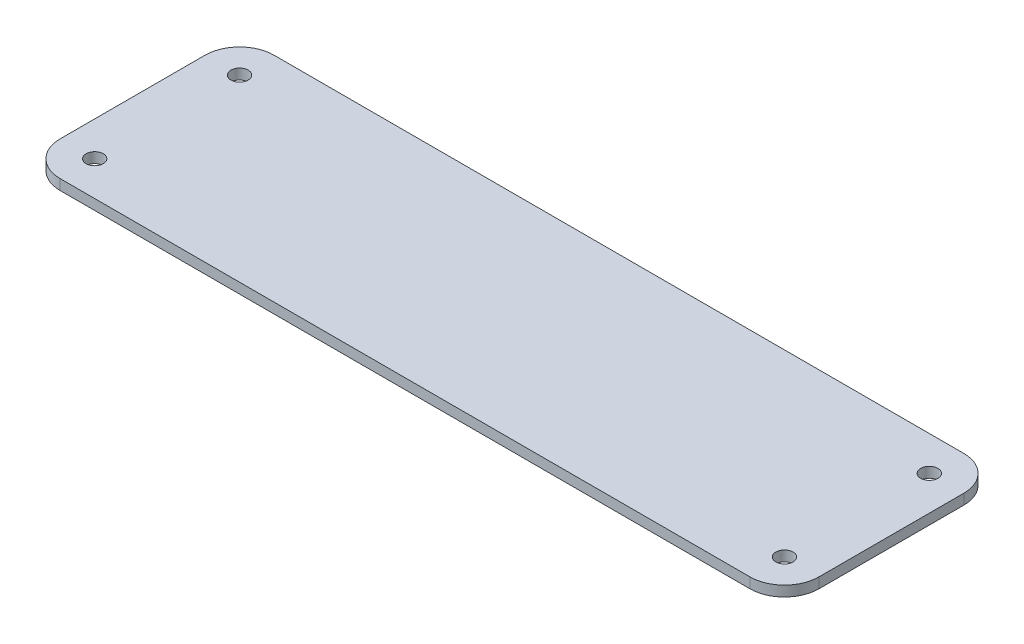
ISO-10303-21;
HEADER;
FILE_DESCRIPTION(('STEP AP214'),'2;1');
FILE_NAME('part.step','',(''),(''),'','','');
FILE_SCHEMA(('AUTOMOTIVE_DESIGN { 1 0 10303 214 1 1 1 1 }'));
ENDSEC;
DATA;
#1=APPLICATION_CONTEXT('core data for automotive mechanical design processes');
#2=APPLICATION_PROTOCOL_DEFINITION('international standard','automotive_design',2000,#1);
#3=PRODUCT_CONTEXT('',#1,'mechanical');
#4=PRODUCT('Part','Part','',(#3));
#5=PRODUCT_RELATED_PRODUCT_CATEGORY('part','',(#4));
#6=PRODUCT_DEFINITION_FORMATION('','',#4);
#7=PRODUCT_DEFINITION_CONTEXT('part definition',#1,'design');
#8=PRODUCT_DEFINITION('design','',#6,#7);
#9=PRODUCT_DEFINITION_SHAPE('','',#8);
#10=(LENGTH_UNIT() NAMED_UNIT(*) SI_UNIT(.MILLI.,.METRE.));
#11=(NAMED_UNIT(*) PLANE_ANGLE_UNIT() SI_UNIT($,.RADIAN.));
#12=(NAMED_UNIT(*) SI_UNIT($,.STERADIAN.) SOLID_ANGLE_UNIT());
#13=UNCERTAINTY_MEASURE_WITH_UNIT(LENGTH_MEASURE(1.E-05),#10,'distance_accuracy_value','');
#14=(GEOMETRIC_REPRESENTATION_CONTEXT(3) GLOBAL_UNCERTAINTY_ASSIGNED_CONTEXT((#13)) GLOBAL_UNIT_ASSIGNED_CONTEXT((#10,
#11,#12)) REPRESENTATION_CONTEXT('',''));
#15=CARTESIAN_POINT('',(0.,0.,0.));
#16=DIRECTION('',(0.,0.,1.));
#17=DIRECTION('',(1.,0.,0.));
#18=AXIS2_PLACEMENT_3D('',#15,#16,#17);
#19=CARTESIAN_POINT('',(-100.,3.,-10.));
#20=DIRECTION('',(0.,1.,0.));
#21=DIRECTION('',(0.,0.,1.));
#22=AXIS2_PLACEMENT_3D('',#19,#20,#21);
#23=PLANE('',#22);
#24=CARTESIAN_POINT('',(100.,3.,-52.));
#25=DIRECTION('',(0.,1.,0.));
#26=DIRECTION('',(0.,0.,-1.));
#27=AXIS2_PLACEMENT_3D('',#24,#25,#26);
#28=CIRCLE('',#27,2.50000000000001);
#29=CARTESIAN_POINT('',(100.,3.,-54.5));
#30=VERTEX_POINT('',#29);
#31=EDGE_CURVE('E188',#30,#30,#28,.T.);
#32=ORIENTED_EDGE('',*,*,#31,.F.);
#33=EDGE_LOOP('',(#32));
#34=FACE_BOUND('',#33,.T.);
#35=CARTESIAN_POINT('',(-100.,3.,-52.));
#36=DIRECTION('',(0.,1.,0.));
#37=DIRECTION('',(0.,0.,1.));
#38=AXIS2_PLACEMENT_3D('',#35,#36,#37);
#39=CIRCLE('',#38,2.50000000000001);
#40=CARTESIAN_POINT('',(-100.,3.,-49.5));
#41=VERTEX_POINT('',#40);
#42=EDGE_CURVE('E134',#41,#41,#39,.T.);
#43=ORIENTED_EDGE('',*,*,#42,.F.);
#44=EDGE_LOOP('',(#43));
#45=FACE_BOUND('',#44,.T.);
#46=CARTESIAN_POINT('',(-100.,3.,-10.));
#47=DIRECTION('',(0.,1.,0.));
#48=DIRECTION('',(0.,0.,1.));
#49=AXIS2_PLACEMENT_3D('',#46,#47,#48);
#50=CIRCLE('',#49,10.);
#51=CARTESIAN_POINT('',(-110.,3.,-10.0000000000001));
#52=VERTEX_POINT('',#51);
#53=CARTESIAN_POINT('',(-99.9999999999999,3.,0.));
#54=VERTEX_POINT('',#53);
#55=EDGE_CURVE('E145',#52,#54,#50,.T.);
#56=ORIENTED_EDGE('',*,*,#55,.T.);
#57=DIRECTION('',(1.,0.,0.));
#58=VECTOR('',#57,1.);
#59=CARTESIAN_POINT('',(-99.9999999999999,3.,0.));
#60=LINE('',#59,#58);
#61=CARTESIAN_POINT('',(99.9999999999999,3.,0.));
#62=VERTEX_POINT('',#61);
#63=EDGE_CURVE('E93',#54,#62,#60,.T.);
#64=ORIENTED_EDGE('',*,*,#63,.T.);
#65=CARTESIAN_POINT('',(100.,3.,-10.));
#66=DIRECTION('',(0.,1.,0.));
#67=DIRECTION('',(0.,0.,1.));
#68=AXIS2_PLACEMENT_3D('',#65,#66,#67);
#69=CIRCLE('',#68,10.);
#70=CARTESIAN_POINT('',(110.,3.,-10.0000000000001));
#71=VERTEX_POINT('',#70);
#72=EDGE_CURVE('E160',#62,#71,#69,.T.);
#73=ORIENTED_EDGE('',*,*,#72,.T.);
#74=DIRECTION('',(0.,0.,-1.));
#75=VECTOR('',#74,1.);
#76=CARTESIAN_POINT('',(110.,3.,-51.9999999999999));
#77=LINE('',#76,#75);
#78=CARTESIAN_POINT('',(110.,3.,-51.9999999999999));
#79=VERTEX_POINT('',#78);
#80=EDGE_CURVE('E173',#71,#79,#77,.T.);
#81=ORIENTED_EDGE('',*,*,#80,.T.);
#82=CARTESIAN_POINT('',(100.,3.,-52.));
#83=DIRECTION('',(0.,1.,0.));
#84=DIRECTION('',(0.,0.,-1.));
#85=AXIS2_PLACEMENT_3D('',#82,#83,#84);
#86=CIRCLE('',#85,10.);
#87=CARTESIAN_POINT('',(99.9999999999999,3.,-62.));
#88=VERTEX_POINT('',#87);
#89=EDGE_CURVE('E112',#79,#88,#86,.T.);
#90=ORIENTED_EDGE('',*,*,#89,.T.);
#91=DIRECTION('',(-1.,0.,0.));
#92=VECTOR('',#91,1.);
#93=CARTESIAN_POINT('',(-99.9999999999999,3.,-62.));
#94=LINE('',#93,#92);
#95=CARTESIAN_POINT('',(-99.9999999999999,3.,-62.));
#96=VERTEX_POINT('',#95);
#97=EDGE_CURVE('E106',#88,#96,#94,.T.);
#98=ORIENTED_EDGE('',*,*,#97,.T.);
#99=CARTESIAN_POINT('',(-100.,3.,-52.));
#100=DIRECTION('',(0.,1.,0.));
#101=DIRECTION('',(0.,0.,1.));
#102=AXIS2_PLACEMENT_3D('',#99,#100,#101);
#103=CIRCLE('',#102,9.99999999999999);
#104=CARTESIAN_POINT('',(-110.,3.,-51.9999999999999));
#105=VERTEX_POINT('',#104);
#106=EDGE_CURVE('E110',#96,#105,#103,.T.);
#107=ORIENTED_EDGE('',*,*,#106,.T.);
#108=DIRECTION('',(0.,0.,1.));
#109=VECTOR('',#108,1.);
#110=CARTESIAN_POINT('',(-110.,3.,-51.9999999999999));
#111=LINE('',#110,#109);
#112=EDGE_CURVE('E50',#105,#52,#111,.T.);
#113=ORIENTED_EDGE('',*,*,#112,.T.);
#114=EDGE_LOOP('',(#56,#64,#73,#81,#90,#98,#107,#113));
#115=FACE_BOUND('',#114,.T.);
#116=CARTESIAN_POINT('',(-100.,3.,-10.));
#117=DIRECTION('',(0.,1.,0.));
#118=DIRECTION('',(0.,0.,1.));
#119=AXIS2_PLACEMENT_3D('',#116,#117,#118);
#120=CIRCLE('',#119,2.49999999999999);
#121=CARTESIAN_POINT('',(-100.,3.,-7.50000000000001));
#122=VERTEX_POINT('',#121);
#123=EDGE_CURVE('E182',#122,#122,#120,.T.);
#124=ORIENTED_EDGE('',*,*,#123,.F.);
#125=EDGE_LOOP('',(#124));
#126=FACE_BOUND('',#125,.T.);
#127=CARTESIAN_POINT('',(100.,3.,-10.));
#128=DIRECTION('',(0.,1.,0.));
#129=DIRECTION('',(0.,0.,-1.));
#130=AXIS2_PLACEMENT_3D('',#127,#128,#129);
#131=CIRCLE('',#130,2.49999999999999);
#132=CARTESIAN_POINT('',(100.,3.,-12.5));
#133=VERTEX_POINT('',#132);
#134=EDGE_CURVE('E194',#133,#133,#131,.T.);
#135=ORIENTED_EDGE('',*,*,#134,.F.);
#136=EDGE_LOOP('',(#135));
#137=FACE_BOUND('',#136,.T.);
#138=ADVANCED_FACE('F33',(#34,#45,#115,#126,#137),#23,.T.);
#139=CARTESIAN_POINT('',(-100.,0.,-10.));
#140=DIRECTION('',(0.,1.,0.));
#141=DIRECTION('',(0.,0.,1.));
#142=AXIS2_PLACEMENT_3D('',#139,#140,#141);
#143=PLANE('',#142);
#144=CARTESIAN_POINT('',(-100.,0.,-10.));
#145=DIRECTION('',(0.,1.,0.));
#146=DIRECTION('',(0.,0.,1.));
#147=AXIS2_PLACEMENT_3D('',#144,#145,#146);
#148=CIRCLE('',#147,10.);
#149=CARTESIAN_POINT('',(-110.,0.,-10.0000000000001));
#150=VERTEX_POINT('',#149);
#151=CARTESIAN_POINT('',(-99.9999999999999,0.,0.));
#152=VERTEX_POINT('',#151);
#153=EDGE_CURVE('E130',#150,#152,#148,.T.);
#154=ORIENTED_EDGE('',*,*,#153,.F.);
#155=DIRECTION('',(0.,0.,1.));
#156=VECTOR('',#155,1.);
#157=CARTESIAN_POINT('',(-110.,0.,-51.9999999999999));
#158=LINE('',#157,#156);
#159=CARTESIAN_POINT('',(-110.,0.,-51.9999999999999));
#160=VERTEX_POINT('',#159);
#161=EDGE_CURVE('E85',#160,#150,#158,.T.);
#162=ORIENTED_EDGE('',*,*,#161,.F.);
#163=CARTESIAN_POINT('',(-100.,0.,-52.));
#164=DIRECTION('',(0.,1.,0.));
#165=DIRECTION('',(0.,0.,1.));
#166=AXIS2_PLACEMENT_3D('',#163,#164,#165);
#167=CIRCLE('',#166,9.99999999999999);
#168=CARTESIAN_POINT('',(-99.9999999999999,0.,-62.));
#169=VERTEX_POINT('',#168);
#170=EDGE_CURVE('E79',#169,#160,#167,.T.);
#171=ORIENTED_EDGE('',*,*,#170,.F.);
#172=DIRECTION('',(-1.,0.,0.));
#173=VECTOR('',#172,1.);
#174=CARTESIAN_POINT('',(-99.9999999999999,0.,-62.));
#175=LINE('',#174,#173);
#176=CARTESIAN_POINT('',(99.9999999999999,0.,-62.));
#177=VERTEX_POINT('',#176);
#178=EDGE_CURVE('E120',#177,#169,#175,.T.);
#179=ORIENTED_EDGE('',*,*,#178,.F.);
#180=CARTESIAN_POINT('',(100.,0.,-52.));
#181=DIRECTION('',(0.,1.,0.));
#182=DIRECTION('',(0.,0.,-1.));
#183=AXIS2_PLACEMENT_3D('',#180,#181,#182);
#184=CIRCLE('',#183,10.);
#185=CARTESIAN_POINT('',(110.,0.,-51.9999999999999));
#186=VERTEX_POINT('',#185);
#187=EDGE_CURVE('E140',#186,#177,#184,.T.);
#188=ORIENTED_EDGE('',*,*,#187,.F.);
#189=DIRECTION('',(0.,0.,-1.));
#190=VECTOR('',#189,1.);
#191=CARTESIAN_POINT('',(110.,0.,-51.9999999999999));
#192=LINE('',#191,#190);
#193=CARTESIAN_POINT('',(110.,0.,-10.0000000000001));
#194=VERTEX_POINT('',#193);
#195=EDGE_CURVE('E138',#194,#186,#192,.T.);
#196=ORIENTED_EDGE('',*,*,#195,.F.);
#197=CARTESIAN_POINT('',(100.,0.,-10.));
#198=DIRECTION('',(0.,1.,0.));
#199=DIRECTION('',(0.,0.,1.));
#200=AXIS2_PLACEMENT_3D('',#197,#198,#199);
#201=CIRCLE('',#200,10.);
#202=CARTESIAN_POINT('',(99.9999999999999,0.,0.));
#203=VERTEX_POINT('',#202);
#204=EDGE_CURVE('E136',#203,#194,#201,.T.);
#205=ORIENTED_EDGE('',*,*,#204,.F.);
#206=DIRECTION('',(1.,0.,0.));
#207=VECTOR('',#206,1.);
#208=CARTESIAN_POINT('',(-99.9999999999999,0.,0.));
#209=LINE('',#208,#207);
#210=EDGE_CURVE('E133',#152,#203,#209,.T.);
#211=ORIENTED_EDGE('',*,*,#210,.F.);
#212=EDGE_LOOP('',(#154,#162,#171,#179,#188,#196,#205,#211));
#213=FACE_BOUND('',#212,.T.);
#214=CARTESIAN_POINT('',(-100.,0.,-52.));
#215=DIRECTION('',(0.,1.,0.));
#216=DIRECTION('',(0.,0.,1.));
#217=AXIS2_PLACEMENT_3D('',#214,#215,#216);
#218=CIRCLE('',#217,2.50000000000001);
#219=CARTESIAN_POINT('',(-100.,0.,-49.5));
#220=VERTEX_POINT('',#219);
#221=EDGE_CURVE('E179',#220,#220,#218,.T.);
#222=ORIENTED_EDGE('',*,*,#221,.T.);
#223=EDGE_LOOP('',(#222));
#224=FACE_BOUND('',#223,.T.);
#225=CARTESIAN_POINT('',(-100.,0.,-10.));
#226=DIRECTION('',(0.,1.,0.));
#227=DIRECTION('',(0.,0.,1.));
#228=AXIS2_PLACEMENT_3D('',#225,#226,#227);
#229=CIRCLE('',#228,2.49999999999999);
#230=CARTESIAN_POINT('',(-100.,0.,-7.50000000000001));
#231=VERTEX_POINT('',#230);
#232=EDGE_CURVE('E185',#231,#231,#229,.T.);
#233=ORIENTED_EDGE('',*,*,#232,.T.);
#234=EDGE_LOOP('',(#233));
#235=FACE_BOUND('',#234,.T.);
#236=CARTESIAN_POINT('',(100.,0.,-52.));
#237=DIRECTION('',(0.,1.,0.));
#238=DIRECTION('',(0.,0.,-1.));
#239=AXIS2_PLACEMENT_3D('',#236,#237,#238);
#240=CIRCLE('',#239,2.50000000000001);
#241=CARTESIAN_POINT('',(100.,0.,-54.5));
#242=VERTEX_POINT('',#241);
#243=EDGE_CURVE('E191',#242,#242,#240,.T.);
#244=ORIENTED_EDGE('',*,*,#243,.T.);
#245=EDGE_LOOP('',(#244));
#246=FACE_BOUND('',#245,.T.);
#247=CARTESIAN_POINT('',(100.,0.,-10.));
#248=DIRECTION('',(0.,1.,0.));
#249=DIRECTION('',(0.,0.,-1.));
#250=AXIS2_PLACEMENT_3D('',#247,#248,#249);
#251=CIRCLE('',#250,2.49999999999999);
#252=CARTESIAN_POINT('',(100.,0.,-12.5));
#253=VERTEX_POINT('',#252);
#254=EDGE_CURVE('E197',#253,#253,#251,.T.);
#255=ORIENTED_EDGE('',*,*,#254,.T.);
#256=EDGE_LOOP('',(#255));
#257=FACE_BOUND('',#256,.T.);
#258=ADVANCED_FACE('F164',(#213,#224,#235,#246,#257),#143,.F.);
#259=CARTESIAN_POINT('',(-100.,3.,-10.));
#260=DIRECTION('',(0.,-1.,0.));
#261=DIRECTION('',(0.,0.,-1.));
#262=AXIS2_PLACEMENT_3D('',#259,#260,#261);
#263=CYLINDRICAL_SURFACE('',#262,10.);
#264=ORIENTED_EDGE('',*,*,#153,.T.);
#265=DIRECTION('',(0.,-1.,0.));
#266=VECTOR('',#265,1.);
#267=CARTESIAN_POINT('',(-99.9999999999999,3.,0.));
#268=LINE('',#267,#266);
#269=EDGE_CURVE('E11',#54,#152,#268,.T.);
#270=ORIENTED_EDGE('',*,*,#269,.F.);
#271=ORIENTED_EDGE('',*,*,#55,.F.);
#272=DIRECTION('',(0.,-1.,0.));
#273=VECTOR('',#272,1.);
#274=CARTESIAN_POINT('',(-110.,3.,-10.0000000000001));
#275=LINE('',#274,#273);
#276=EDGE_CURVE('E126',#52,#150,#275,.T.);
#277=ORIENTED_EDGE('',*,*,#276,.T.);
#278=EDGE_LOOP('',(#264,#270,#271,#277));
#279=FACE_BOUND('',#278,.T.);
#280=ADVANCED_FACE('F35',(#279),#263,.T.);
#281=CARTESIAN_POINT('',(-99.9999999999999,3.,0.));
#282=DIRECTION('',(0.,0.,-1.));
#283=DIRECTION('',(-1.,0.,0.));
#284=AXIS2_PLACEMENT_3D('',#281,#282,#283);
#285=PLANE('',#284);
#286=ORIENTED_EDGE('',*,*,#210,.T.);
#287=DIRECTION('',(0.,-1.,0.));
#288=VECTOR('',#287,1.);
#289=CARTESIAN_POINT('',(99.9999999999999,3.,0.));
#290=LINE('',#289,#288);
#291=EDGE_CURVE('E42',#62,#203,#290,.T.);
#292=ORIENTED_EDGE('',*,*,#291,.F.);
#293=ORIENTED_EDGE('',*,*,#63,.F.);
#294=ORIENTED_EDGE('',*,*,#269,.T.);
#295=EDGE_LOOP('',(#286,#292,#293,#294));
#296=FACE_BOUND('',#295,.T.);
#297=ADVANCED_FACE('F231',(#296),#285,.F.);
#298=CARTESIAN_POINT('',(100.,3.,-10.));
#299=DIRECTION('',(0.,-1.,0.));
#300=DIRECTION('',(0.,0.,-1.));
#301=AXIS2_PLACEMENT_3D('',#298,#299,#300);
#302=CYLINDRICAL_SURFACE('',#301,10.);
#303=ORIENTED_EDGE('',*,*,#204,.T.);
#304=DIRECTION('',(0.,-1.,0.));
#305=VECTOR('',#304,1.);
#306=CARTESIAN_POINT('',(110.,3.,-10.0000000000001));
#307=LINE('',#306,#305);
#308=EDGE_CURVE('E152',#71,#194,#307,.T.);
#309=ORIENTED_EDGE('',*,*,#308,.F.);
#310=ORIENTED_EDGE('',*,*,#72,.F.);
#311=ORIENTED_EDGE('',*,*,#291,.T.);
#312=EDGE_LOOP('',(#303,#309,#310,#311));
#313=FACE_BOUND('',#312,.T.);
#314=ADVANCED_FACE('F158',(#313),#302,.T.);
#315=CARTESIAN_POINT('',(110.,3.,-51.9999999999999));
#316=DIRECTION('',(-1.,0.,0.));
#317=DIRECTION('',(0.,0.,1.));
#318=AXIS2_PLACEMENT_3D('',#315,#316,#317);
#319=PLANE('',#318);
#320=ORIENTED_EDGE('',*,*,#195,.T.);
#321=DIRECTION('',(0.,-1.,0.));
#322=VECTOR('',#321,1.);
#323=CARTESIAN_POINT('',(110.,3.,-51.9999999999999));
#324=LINE('',#323,#322);
#325=EDGE_CURVE('E149',#79,#186,#324,.T.);
#326=ORIENTED_EDGE('',*,*,#325,.F.);
#327=ORIENTED_EDGE('',*,*,#80,.F.);
#328=ORIENTED_EDGE('',*,*,#308,.T.);
#329=EDGE_LOOP('',(#320,#326,#327,#328));
#330=FACE_BOUND('',#329,.T.);
#331=ADVANCED_FACE('F169',(#330),#319,.F.);
#332=CARTESIAN_POINT('',(100.,3.,-52.));
#333=DIRECTION('',(0.,-1.,0.));
#334=DIRECTION('',(0.,0.,-1.));
#335=AXIS2_PLACEMENT_3D('',#332,#333,#334);
#336=CYLINDRICAL_SURFACE('',#335,10.);
#337=ORIENTED_EDGE('',*,*,#187,.T.);
#338=DIRECTION('',(0.,-1.,0.));
#339=VECTOR('',#338,1.);
#340=CARTESIAN_POINT('',(99.9999999999999,3.,-62.));
#341=LINE('',#340,#339);
#342=EDGE_CURVE('E121',#88,#177,#341,.T.);
#343=ORIENTED_EDGE('',*,*,#342,.F.);
#344=ORIENTED_EDGE('',*,*,#89,.F.);
#345=ORIENTED_EDGE('',*,*,#325,.T.);
#346=EDGE_LOOP('',(#337,#343,#344,#345));
#347=FACE_BOUND('',#346,.T.);
#348=ADVANCED_FACE('F172',(#347),#336,.T.);
#349=CARTESIAN_POINT('',(-99.9999999999999,3.,-62.));
#350=DIRECTION('',(0.,0.,1.));
#351=DIRECTION('',(1.,0.,0.));
#352=AXIS2_PLACEMENT_3D('',#349,#350,#351);
#353=PLANE('',#352);
#354=ORIENTED_EDGE('',*,*,#178,.T.);
#355=DIRECTION('',(0.,-1.,0.));
#356=VECTOR('',#355,1.);
#357=CARTESIAN_POINT('',(-99.9999999999999,3.,-62.));
#358=LINE('',#357,#356);
#359=EDGE_CURVE('E117',#96,#169,#358,.T.);
#360=ORIENTED_EDGE('',*,*,#359,.F.);
#361=ORIENTED_EDGE('',*,*,#97,.F.);
#362=ORIENTED_EDGE('',*,*,#342,.T.);
#363=EDGE_LOOP('',(#354,#360,#361,#362));
#364=FACE_BOUND('',#363,.T.);
#365=ADVANCED_FACE('F118',(#364),#353,.F.);
#366=CARTESIAN_POINT('',(-100.,3.,-52.));
#367=DIRECTION('',(0.,-1.,0.));
#368=DIRECTION('',(0.,0.,-1.));
#369=AXIS2_PLACEMENT_3D('',#366,#367,#368);
#370=CYLINDRICAL_SURFACE('',#369,9.99999999999999);
#371=ORIENTED_EDGE('',*,*,#170,.T.);
#372=DIRECTION('',(0.,-1.,0.));
#373=VECTOR('',#372,1.);
#374=CARTESIAN_POINT('',(-110.,3.,-51.9999999999999));
#375=LINE('',#374,#373);
#376=EDGE_CURVE('E122',#105,#160,#375,.T.);
#377=ORIENTED_EDGE('',*,*,#376,.F.);
#378=ORIENTED_EDGE('',*,*,#106,.F.);
#379=ORIENTED_EDGE('',*,*,#359,.T.);
#380=EDGE_LOOP('',(#371,#377,#378,#379));
#381=FACE_BOUND('',#380,.T.);
#382=ADVANCED_FACE('F124',(#381),#370,.T.);
#383=CARTESIAN_POINT('',(-110.,3.,-51.9999999999999));
#384=DIRECTION('',(1.,0.,0.));
#385=DIRECTION('',(0.,0.,-1.));
#386=AXIS2_PLACEMENT_3D('',#383,#384,#385);
#387=PLANE('',#386);
#388=ORIENTED_EDGE('',*,*,#161,.T.);
#389=ORIENTED_EDGE('',*,*,#276,.F.);
#390=ORIENTED_EDGE('',*,*,#112,.F.);
#391=ORIENTED_EDGE('',*,*,#376,.T.);
#392=EDGE_LOOP('',(#388,#389,#390,#391));
#393=FACE_BOUND('',#392,.T.);
#394=ADVANCED_FACE('F219',(#393),#387,.F.);
#395=CARTESIAN_POINT('',(-100.,3.,-52.));
#396=DIRECTION('',(0.,-1.,0.));
#397=DIRECTION('',(0.,0.,-1.));
#398=AXIS2_PLACEMENT_3D('',#395,#396,#397);
#399=CYLINDRICAL_SURFACE('',#398,2.50000000000001);
#400=ORIENTED_EDGE('',*,*,#42,.T.);
#401=EDGE_LOOP('',(#400));
#402=FACE_BOUND('',#401,.T.);
#403=ORIENTED_EDGE('',*,*,#221,.F.);
#404=EDGE_LOOP('',(#403));
#405=FACE_BOUND('',#404,.T.);
#406=ADVANCED_FACE('F216',(#402,#405),#399,.F.);
#407=CARTESIAN_POINT('',(-100.,3.,-10.));
#408=DIRECTION('',(0.,-1.,0.));
#409=DIRECTION('',(0.,0.,-1.));
#410=AXIS2_PLACEMENT_3D('',#407,#408,#409);
#411=CYLINDRICAL_SURFACE('',#410,2.49999999999999);
#412=ORIENTED_EDGE('',*,*,#123,.T.);
#413=EDGE_LOOP('',(#412));
#414=FACE_BOUND('',#413,.T.);
#415=ORIENTED_EDGE('',*,*,#232,.F.);
#416=EDGE_LOOP('',(#415));
#417=FACE_BOUND('',#416,.T.);
#418=ADVANCED_FACE('F295',(#414,#417),#411,.F.);
#419=CARTESIAN_POINT('',(100.,3.,-52.));
#420=DIRECTION('',(0.,-1.,0.));
#421=DIRECTION('',(0.,0.,-1.));
#422=AXIS2_PLACEMENT_3D('',#419,#420,#421);
#423=CYLINDRICAL_SURFACE('',#422,2.50000000000001);
#424=ORIENTED_EDGE('',*,*,#31,.T.);
#425=EDGE_LOOP('',(#424));
#426=FACE_BOUND('',#425,.T.);
#427=ORIENTED_EDGE('',*,*,#243,.F.);
#428=EDGE_LOOP('',(#427));
#429=FACE_BOUND('',#428,.T.);
#430=ADVANCED_FACE('F303',(#426,#429),#423,.F.);
#431=CARTESIAN_POINT('',(100.,3.,-10.));
#432=DIRECTION('',(0.,-1.,0.));
#433=DIRECTION('',(0.,0.,-1.));
#434=AXIS2_PLACEMENT_3D('',#431,#432,#433);
#435=CYLINDRICAL_SURFACE('',#434,2.49999999999999);
#436=ORIENTED_EDGE('',*,*,#134,.T.);
#437=EDGE_LOOP('',(#436));
#438=FACE_BOUND('',#437,.T.);
#439=ORIENTED_EDGE('',*,*,#254,.F.);
#440=EDGE_LOOP('',(#439));
#441=FACE_BOUND('',#440,.T.);
#442=ADVANCED_FACE('F203',(#438,#441),#435,.F.);
#443=CLOSED_SHELL('',(#138,#258,#280,#297,#314,#331,#348,#365,#382,#394,#406,#418,#430,#442));
#444=MANIFOLD_SOLID_BREP('B2',#443);
#445=ADVANCED_BREP_SHAPE_REPRESENTATION('',(#18,#444),#14);
#446=SHAPE_DEFINITION_REPRESENTATION(#9,#445);
ENDSEC;
END-ISO-10303-21;
